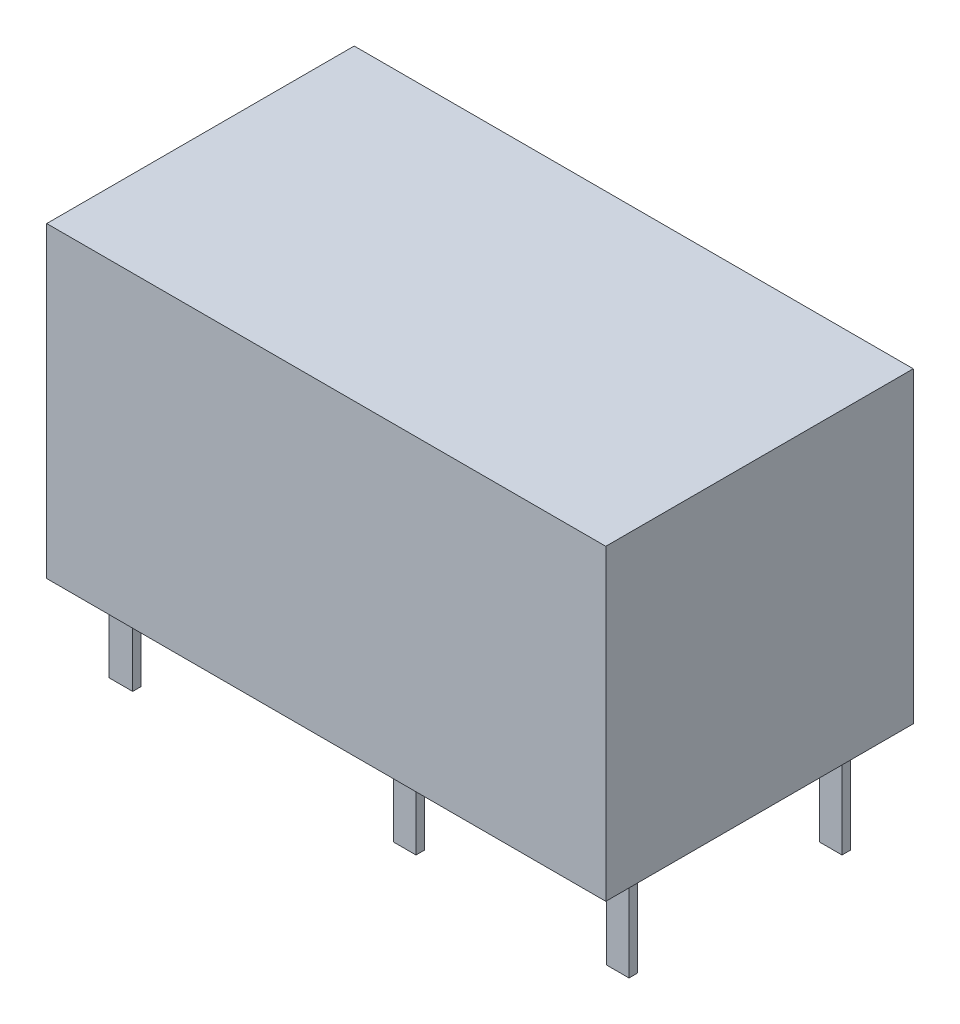
ISO-10303-21;
HEADER;
FILE_DESCRIPTION(('STEP AP214'),'2;1');
FILE_NAME('part.step','',(''),(''),'','','');
FILE_SCHEMA(('AUTOMOTIVE_DESIGN { 1 0 10303 214 1 1 1 1 }'));
ENDSEC;
DATA;
#1=APPLICATION_CONTEXT('core data for automotive mechanical design processes');
#2=APPLICATION_PROTOCOL_DEFINITION('international standard','automotive_design',2000,#1);
#3=PRODUCT_CONTEXT('',#1,'mechanical');
#4=PRODUCT('Part','Part','',(#3));
#5=PRODUCT_RELATED_PRODUCT_CATEGORY('part','',(#4));
#6=PRODUCT_DEFINITION_FORMATION('','',#4);
#7=PRODUCT_DEFINITION_CONTEXT('part definition',#1,'design');
#8=PRODUCT_DEFINITION('design','',#6,#7);
#9=PRODUCT_DEFINITION_SHAPE('','',#8);
#10=(LENGTH_UNIT() NAMED_UNIT(*) SI_UNIT(.MILLI.,.METRE.));
#11=(NAMED_UNIT(*) PLANE_ANGLE_UNIT() SI_UNIT($,.RADIAN.));
#12=(NAMED_UNIT(*) SI_UNIT($,.STERADIAN.) SOLID_ANGLE_UNIT());
#13=UNCERTAINTY_MEASURE_WITH_UNIT(LENGTH_MEASURE(1.E-05),#10,'distance_accuracy_value','');
#14=(GEOMETRIC_REPRESENTATION_CONTEXT(3) GLOBAL_UNCERTAINTY_ASSIGNED_CONTEXT((#13)) GLOBAL_UNIT_ASSIGNED_CONTEXT((#10,
#11,#12)) REPRESENTATION_CONTEXT('',''));
#15=CARTESIAN_POINT('',(0.,0.,0.));
#16=DIRECTION('',(0.,0.,1.));
#17=DIRECTION('',(1.,0.,0.));
#18=AXIS2_PLACEMENT_3D('',#15,#16,#17);
#19=CARTESIAN_POINT('',(10.,5.5,0.));
#20=DIRECTION('',(-1.,0.,0.));
#21=DIRECTION('',(0.,0.,1.));
#22=AXIS2_PLACEMENT_3D('',#19,#20,#21);
#23=PLANE('',#22);
#24=DIRECTION('',(0.,0.,-1.));
#25=VECTOR('',#24,1.);
#26=CARTESIAN_POINT('',(10.,0.,0.));
#27=LINE('',#26,#25);
#28=CARTESIAN_POINT('',(10.,0.,5.5));
#29=VERTEX_POINT('',#28);
#30=CARTESIAN_POINT('',(10.,0.,-5.5));
#31=VERTEX_POINT('',#30);
#32=EDGE_CURVE('E287',#29,#31,#27,.T.);
#33=ORIENTED_EDGE('',*,*,#32,.T.);
#34=DIRECTION('',(0.,-1.,0.));
#35=VECTOR('',#34,1.);
#36=CARTESIAN_POINT('',(10.,5.5,-5.5));
#37=LINE('',#36,#35);
#38=CARTESIAN_POINT('',(10.,11.,-5.5));
#39=VERTEX_POINT('',#38);
#40=EDGE_CURVE('E180',#39,#31,#37,.T.);
#41=ORIENTED_EDGE('',*,*,#40,.F.);
#42=DIRECTION('',(0.,0.,-1.));
#43=VECTOR('',#42,1.);
#44=CARTESIAN_POINT('',(10.,11.,0.));
#45=LINE('',#44,#43);
#46=CARTESIAN_POINT('',(10.,11.,5.5));
#47=VERTEX_POINT('',#46);
#48=EDGE_CURVE('E9',#47,#39,#45,.T.);
#49=ORIENTED_EDGE('',*,*,#48,.F.);
#50=DIRECTION('',(0.,1.,0.));
#51=VECTOR('',#50,1.);
#52=CARTESIAN_POINT('',(10.,5.5,5.5));
#53=LINE('',#52,#51);
#54=EDGE_CURVE('E183',#29,#47,#53,.T.);
#55=ORIENTED_EDGE('',*,*,#54,.F.);
#56=EDGE_LOOP('',(#33,#41,#49,#55));
#57=FACE_BOUND('',#56,.T.);
#58=ADVANCED_FACE('F15',(#57),#23,.F.);
#59=CARTESIAN_POINT('',(0.,11.,0.));
#60=DIRECTION('',(0.,-1.,0.));
#61=DIRECTION('',(0.,0.,-1.));
#62=AXIS2_PLACEMENT_3D('',#59,#60,#61);
#63=PLANE('',#62);
#64=ORIENTED_EDGE('',*,*,#48,.T.);
#65=DIRECTION('',(1.,0.,0.));
#66=VECTOR('',#65,1.);
#67=CARTESIAN_POINT('',(0.,11.,-5.5));
#68=LINE('',#67,#66);
#69=CARTESIAN_POINT('',(-10.,11.,-5.5));
#70=VERTEX_POINT('',#69);
#71=EDGE_CURVE('E19',#70,#39,#68,.T.);
#72=ORIENTED_EDGE('',*,*,#71,.F.);
#73=DIRECTION('',(0.,0.,-1.));
#74=VECTOR('',#73,1.);
#75=CARTESIAN_POINT('',(-10.,11.,0.));
#76=LINE('',#75,#74);
#77=CARTESIAN_POINT('',(-10.,11.,5.5));
#78=VERTEX_POINT('',#77);
#79=EDGE_CURVE('E25',#78,#70,#76,.T.);
#80=ORIENTED_EDGE('',*,*,#79,.F.);
#81=DIRECTION('',(-1.,0.,0.));
#82=VECTOR('',#81,1.);
#83=CARTESIAN_POINT('',(0.,11.,5.5));
#84=LINE('',#83,#82);
#85=EDGE_CURVE('E167',#47,#78,#84,.T.);
#86=ORIENTED_EDGE('',*,*,#85,.F.);
#87=EDGE_LOOP('',(#64,#72,#80,#86));
#88=FACE_BOUND('',#87,.T.);
#89=ADVANCED_FACE('F17',(#88),#63,.F.);
#90=CARTESIAN_POINT('',(-10.,5.5,0.));
#91=DIRECTION('',(1.,0.,0.));
#92=DIRECTION('',(0.,0.,-1.));
#93=AXIS2_PLACEMENT_3D('',#90,#91,#92);
#94=PLANE('',#93);
#95=ORIENTED_EDGE('',*,*,#79,.T.);
#96=DIRECTION('',(0.,1.,0.));
#97=VECTOR('',#96,1.);
#98=CARTESIAN_POINT('',(-10.,5.5,-5.5));
#99=LINE('',#98,#97);
#100=CARTESIAN_POINT('',(-10.,0.,-5.5));
#101=VERTEX_POINT('',#100);
#102=EDGE_CURVE('E237',#101,#70,#99,.T.);
#103=ORIENTED_EDGE('',*,*,#102,.F.);
#104=DIRECTION('',(0.,0.,-1.));
#105=VECTOR('',#104,1.);
#106=CARTESIAN_POINT('',(-10.,0.,0.));
#107=LINE('',#106,#105);
#108=CARTESIAN_POINT('',(-10.,0.,5.5));
#109=VERTEX_POINT('',#108);
#110=EDGE_CURVE('E176',#109,#101,#107,.T.);
#111=ORIENTED_EDGE('',*,*,#110,.F.);
#112=DIRECTION('',(0.,-1.,0.));
#113=VECTOR('',#112,1.);
#114=CARTESIAN_POINT('',(-10.,5.5,5.5));
#115=LINE('',#114,#113);
#116=EDGE_CURVE('E173',#78,#109,#115,.T.);
#117=ORIENTED_EDGE('',*,*,#116,.F.);
#118=EDGE_LOOP('',(#95,#103,#111,#117));
#119=FACE_BOUND('',#118,.T.);
#120=ADVANCED_FACE('F174',(#119),#94,.F.);
#121=CARTESIAN_POINT('',(0.,5.5,-5.5));
#122=DIRECTION('',(0.,0.,1.));
#123=DIRECTION('',(1.,0.,0.));
#124=AXIS2_PLACEMENT_3D('',#121,#122,#123);
#125=PLANE('',#124);
#126=ORIENTED_EDGE('',*,*,#40,.T.);
#127=DIRECTION('',(-1.,0.,0.));
#128=VECTOR('',#127,1.);
#129=CARTESIAN_POINT('',(0.,0.,-5.5));
#130=LINE('',#129,#128);
#131=EDGE_CURVE('E290',#31,#101,#130,.T.);
#132=ORIENTED_EDGE('',*,*,#131,.T.);
#133=ORIENTED_EDGE('',*,*,#102,.T.);
#134=ORIENTED_EDGE('',*,*,#71,.T.);
#135=EDGE_LOOP('',(#126,#132,#133,#134));
#136=FACE_BOUND('',#135,.T.);
#137=ADVANCED_FACE('F513',(#136),#125,.F.);
#138=CARTESIAN_POINT('',(0.,5.5,5.5));
#139=DIRECTION('',(0.,0.,1.));
#140=DIRECTION('',(1.,0.,0.));
#141=AXIS2_PLACEMENT_3D('',#138,#139,#140);
#142=PLANE('',#141);
#143=ORIENTED_EDGE('',*,*,#54,.T.);
#144=ORIENTED_EDGE('',*,*,#85,.T.);
#145=ORIENTED_EDGE('',*,*,#116,.T.);
#146=DIRECTION('',(1.,0.,0.));
#147=VECTOR('',#146,1.);
#148=CARTESIAN_POINT('',(0.,0.,5.5));
#149=LINE('',#148,#147);
#150=EDGE_CURVE('E286',#109,#29,#149,.T.);
#151=ORIENTED_EDGE('',*,*,#150,.T.);
#152=EDGE_LOOP('',(#143,#144,#145,#151));
#153=FACE_BOUND('',#152,.T.);
#154=ADVANCED_FACE('F182',(#153),#142,.T.);
#155=CARTESIAN_POINT('',(-8.465,-1.,3.81));
#156=DIRECTION('',(-1.,0.,0.));
#157=DIRECTION('',(0.,0.,1.));
#158=AXIS2_PLACEMENT_3D('',#155,#156,#157);
#159=PLANE('',#158);
#160=DIRECTION('',(0.,0.,-1.));
#161=VECTOR('',#160,1.);
#162=CARTESIAN_POINT('',(-8.465,0.,1.905));
#163=LINE('',#162,#161);
#164=CARTESIAN_POINT('',(-8.465,0.,3.96));
#165=VERTEX_POINT('',#164);
#166=CARTESIAN_POINT('',(-8.465,0.,3.66));
#167=VERTEX_POINT('',#166);
#168=EDGE_CURVE('E274',#165,#167,#163,.T.);
#169=ORIENTED_EDGE('',*,*,#168,.F.);
#170=DIRECTION('',(0.,1.,0.));
#171=VECTOR('',#170,1.);
#172=CARTESIAN_POINT('',(-8.465,-1.,3.96));
#173=LINE('',#172,#171);
#174=CARTESIAN_POINT('',(-8.465,-3.5,3.96));
#175=VERTEX_POINT('',#174);
#176=EDGE_CURVE('E187',#175,#165,#173,.T.);
#177=ORIENTED_EDGE('',*,*,#176,.F.);
#178=DIRECTION('',(0.,0.,-1.));
#179=VECTOR('',#178,1.);
#180=CARTESIAN_POINT('',(-8.465,-3.5,3.81));
#181=LINE('',#180,#179);
#182=CARTESIAN_POINT('',(-8.465,-3.5,3.66));
#183=VERTEX_POINT('',#182);
#184=EDGE_CURVE('E184',#175,#183,#181,.T.);
#185=ORIENTED_EDGE('',*,*,#184,.T.);
#186=DIRECTION('',(0.,-1.,0.));
#187=VECTOR('',#186,1.);
#188=CARTESIAN_POINT('',(-8.465,-1.,3.66));
#189=LINE('',#188,#187);
#190=EDGE_CURVE('E192',#167,#183,#189,.T.);
#191=ORIENTED_EDGE('',*,*,#190,.F.);
#192=EDGE_LOOP('',(#169,#177,#185,#191));
#193=FACE_BOUND('',#192,.T.);
#194=ADVANCED_FACE('F508',(#193),#159,.F.);
#195=CARTESIAN_POINT('',(-8.89,-3.5,3.81));
#196=DIRECTION('',(0.,1.,0.));
#197=DIRECTION('',(0.,0.,1.));
#198=AXIS2_PLACEMENT_3D('',#195,#196,#197);
#199=PLANE('',#198);
#200=DIRECTION('',(0.,0.,-1.));
#201=VECTOR('',#200,1.);
#202=CARTESIAN_POINT('',(-9.315,-3.5,3.81));
#203=LINE('',#202,#201);
#204=CARTESIAN_POINT('',(-9.315,-3.5,3.96));
#205=VERTEX_POINT('',#204);
#206=CARTESIAN_POINT('',(-9.315,-3.5,3.66));
#207=VERTEX_POINT('',#206);
#208=EDGE_CURVE('E198',#205,#207,#203,.T.);
#209=ORIENTED_EDGE('',*,*,#208,.T.);
#210=DIRECTION('',(-1.,0.,0.));
#211=VECTOR('',#210,1.);
#212=CARTESIAN_POINT('',(-8.89,-3.5,3.66));
#213=LINE('',#212,#211);
#214=EDGE_CURVE('E190',#183,#207,#213,.T.);
#215=ORIENTED_EDGE('',*,*,#214,.F.);
#216=ORIENTED_EDGE('',*,*,#184,.F.);
#217=DIRECTION('',(1.,0.,0.));
#218=VECTOR('',#217,1.);
#219=CARTESIAN_POINT('',(-8.89,-3.5,3.96));
#220=LINE('',#219,#218);
#221=EDGE_CURVE('E189',#205,#175,#220,.T.);
#222=ORIENTED_EDGE('',*,*,#221,.F.);
#223=EDGE_LOOP('',(#209,#215,#216,#222));
#224=FACE_BOUND('',#223,.T.);
#225=ADVANCED_FACE('F504',(#224),#199,.F.);
#226=CARTESIAN_POINT('',(-8.89,-1.,3.96));
#227=DIRECTION('',(0.,0.,1.));
#228=DIRECTION('',(1.,0.,0.));
#229=AXIS2_PLACEMENT_3D('',#226,#227,#228);
#230=PLANE('',#229);
#231=DIRECTION('',(1.,0.,0.));
#232=VECTOR('',#231,1.);
#233=CARTESIAN_POINT('',(-4.445,0.,3.96));
#234=LINE('',#233,#232);
#235=CARTESIAN_POINT('',(-9.315,0.,3.96));
#236=VERTEX_POINT('',#235);
#237=EDGE_CURVE('E277',#236,#165,#234,.T.);
#238=ORIENTED_EDGE('',*,*,#237,.F.);
#239=DIRECTION('',(0.,-1.,0.));
#240=VECTOR('',#239,1.);
#241=CARTESIAN_POINT('',(-9.315,-1.,3.96));
#242=LINE('',#241,#240);
#243=EDGE_CURVE('E195',#236,#205,#242,.T.);
#244=ORIENTED_EDGE('',*,*,#243,.T.);
#245=ORIENTED_EDGE('',*,*,#221,.T.);
#246=ORIENTED_EDGE('',*,*,#176,.T.);
#247=EDGE_LOOP('',(#238,#244,#245,#246));
#248=FACE_BOUND('',#247,.T.);
#249=ADVANCED_FACE('F500',(#248),#230,.T.);
#250=CARTESIAN_POINT('',(-8.89,-1.,3.66));
#251=DIRECTION('',(0.,0.,1.));
#252=DIRECTION('',(1.,0.,0.));
#253=AXIS2_PLACEMENT_3D('',#250,#251,#252);
#254=PLANE('',#253);
#255=DIRECTION('',(-1.,0.,0.));
#256=VECTOR('',#255,1.);
#257=CARTESIAN_POINT('',(-4.445,0.,3.66));
#258=LINE('',#257,#256);
#259=CARTESIAN_POINT('',(-9.315,0.,3.66));
#260=VERTEX_POINT('',#259);
#261=EDGE_CURVE('E283',#167,#260,#258,.T.);
#262=ORIENTED_EDGE('',*,*,#261,.F.);
#263=ORIENTED_EDGE('',*,*,#190,.T.);
#264=ORIENTED_EDGE('',*,*,#214,.T.);
#265=DIRECTION('',(0.,1.,0.));
#266=VECTOR('',#265,1.);
#267=CARTESIAN_POINT('',(-9.315,-1.,3.66));
#268=LINE('',#267,#266);
#269=EDGE_CURVE('E201',#207,#260,#268,.T.);
#270=ORIENTED_EDGE('',*,*,#269,.T.);
#271=EDGE_LOOP('',(#262,#263,#264,#270));
#272=FACE_BOUND('',#271,.T.);
#273=ADVANCED_FACE('F496',(#272),#254,.F.);
#274=CARTESIAN_POINT('',(-9.315,-1.,3.81));
#275=DIRECTION('',(1.,0.,0.));
#276=DIRECTION('',(0.,0.,-1.));
#277=AXIS2_PLACEMENT_3D('',#274,#275,#276);
#278=PLANE('',#277);
#279=DIRECTION('',(0.,0.,1.));
#280=VECTOR('',#279,1.);
#281=CARTESIAN_POINT('',(-9.315,0.,1.905));
#282=LINE('',#281,#280);
#283=EDGE_CURVE('E280',#260,#236,#282,.T.);
#284=ORIENTED_EDGE('',*,*,#283,.F.);
#285=ORIENTED_EDGE('',*,*,#269,.F.);
#286=ORIENTED_EDGE('',*,*,#208,.F.);
#287=ORIENTED_EDGE('',*,*,#243,.F.);
#288=EDGE_LOOP('',(#284,#285,#286,#287));
#289=FACE_BOUND('',#288,.T.);
#290=ADVANCED_FACE('F492',(#289),#278,.F.);
#291=CARTESIAN_POINT('',(-8.465,-1.,-3.81));
#292=DIRECTION('',(-1.,0.,0.));
#293=DIRECTION('',(0.,0.,1.));
#294=AXIS2_PLACEMENT_3D('',#291,#292,#293);
#295=PLANE('',#294);
#296=DIRECTION('',(0.,0.,-1.));
#297=VECTOR('',#296,1.);
#298=CARTESIAN_POINT('',(-8.465,0.,-1.905));
#299=LINE('',#298,#297);
#300=CARTESIAN_POINT('',(-8.465,0.,-3.66));
#301=VERTEX_POINT('',#300);
#302=CARTESIAN_POINT('',(-8.465,0.,-3.96));
#303=VERTEX_POINT('',#302);
#304=EDGE_CURVE('E262',#301,#303,#299,.T.);
#305=ORIENTED_EDGE('',*,*,#304,.F.);
#306=DIRECTION('',(0.,1.,0.));
#307=VECTOR('',#306,1.);
#308=CARTESIAN_POINT('',(-8.465,-1.,-3.66));
#309=LINE('',#308,#307);
#310=CARTESIAN_POINT('',(-8.465,-3.5,-3.66));
#311=VERTEX_POINT('',#310);
#312=EDGE_CURVE('E202',#311,#301,#309,.T.);
#313=ORIENTED_EDGE('',*,*,#312,.F.);
#314=DIRECTION('',(0.,0.,-1.));
#315=VECTOR('',#314,1.);
#316=CARTESIAN_POINT('',(-8.465,-3.5,-3.81));
#317=LINE('',#316,#315);
#318=CARTESIAN_POINT('',(-8.465,-3.5,-3.96));
#319=VERTEX_POINT('',#318);
#320=EDGE_CURVE('E199',#311,#319,#317,.T.);
#321=ORIENTED_EDGE('',*,*,#320,.T.);
#322=DIRECTION('',(0.,-1.,0.));
#323=VECTOR('',#322,1.);
#324=CARTESIAN_POINT('',(-8.465,-1.,-3.96));
#325=LINE('',#324,#323);
#326=EDGE_CURVE('E209',#303,#319,#325,.T.);
#327=ORIENTED_EDGE('',*,*,#326,.F.);
#328=EDGE_LOOP('',(#305,#313,#321,#327));
#329=FACE_BOUND('',#328,.T.);
#330=ADVANCED_FACE('F488',(#329),#295,.F.);
#331=CARTESIAN_POINT('',(-8.89,-3.5,-3.81));
#332=DIRECTION('',(0.,1.,0.));
#333=DIRECTION('',(0.,0.,1.));
#334=AXIS2_PLACEMENT_3D('',#331,#332,#333);
#335=PLANE('',#334);
#336=DIRECTION('',(0.,0.,-1.));
#337=VECTOR('',#336,1.);
#338=CARTESIAN_POINT('',(-9.315,-3.5,-3.81));
#339=LINE('',#338,#337);
#340=CARTESIAN_POINT('',(-9.315,-3.5,-3.66));
#341=VERTEX_POINT('',#340);
#342=CARTESIAN_POINT('',(-9.315,-3.5,-3.96));
#343=VERTEX_POINT('',#342);
#344=EDGE_CURVE('E215',#341,#343,#339,.T.);
#345=ORIENTED_EDGE('',*,*,#344,.T.);
#346=DIRECTION('',(-1.,0.,0.));
#347=VECTOR('',#346,1.);
#348=CARTESIAN_POINT('',(-8.89,-3.5,-3.96));
#349=LINE('',#348,#347);
#350=EDGE_CURVE('E207',#319,#343,#349,.T.);
#351=ORIENTED_EDGE('',*,*,#350,.F.);
#352=ORIENTED_EDGE('',*,*,#320,.F.);
#353=DIRECTION('',(1.,0.,0.));
#354=VECTOR('',#353,1.);
#355=CARTESIAN_POINT('',(-8.89,-3.5,-3.66));
#356=LINE('',#355,#354);
#357=EDGE_CURVE('E204',#341,#311,#356,.T.);
#358=ORIENTED_EDGE('',*,*,#357,.F.);
#359=EDGE_LOOP('',(#345,#351,#352,#358));
#360=FACE_BOUND('',#359,.T.);
#361=ADVANCED_FACE('F484',(#360),#335,.F.);
#362=CARTESIAN_POINT('',(-8.89,-1.,-3.66));
#363=DIRECTION('',(0.,0.,1.));
#364=DIRECTION('',(1.,0.,0.));
#365=AXIS2_PLACEMENT_3D('',#362,#363,#364);
#366=PLANE('',#365);
#367=DIRECTION('',(1.,0.,0.));
#368=VECTOR('',#367,1.);
#369=CARTESIAN_POINT('',(-4.445,0.,-3.66));
#370=LINE('',#369,#368);
#371=CARTESIAN_POINT('',(-9.315,0.,-3.66));
#372=VERTEX_POINT('',#371);
#373=EDGE_CURVE('E265',#372,#301,#370,.T.);
#374=ORIENTED_EDGE('',*,*,#373,.F.);
#375=DIRECTION('',(0.,-1.,0.));
#376=VECTOR('',#375,1.);
#377=CARTESIAN_POINT('',(-9.315,-1.,-3.66));
#378=LINE('',#377,#376);
#379=EDGE_CURVE('E212',#372,#341,#378,.T.);
#380=ORIENTED_EDGE('',*,*,#379,.T.);
#381=ORIENTED_EDGE('',*,*,#357,.T.);
#382=ORIENTED_EDGE('',*,*,#312,.T.);
#383=EDGE_LOOP('',(#374,#380,#381,#382));
#384=FACE_BOUND('',#383,.T.);
#385=ADVANCED_FACE('F480',(#384),#366,.T.);
#386=CARTESIAN_POINT('',(-8.89,-1.,-3.96));
#387=DIRECTION('',(0.,0.,1.));
#388=DIRECTION('',(1.,0.,0.));
#389=AXIS2_PLACEMENT_3D('',#386,#387,#388);
#390=PLANE('',#389);
#391=DIRECTION('',(-1.,0.,0.));
#392=VECTOR('',#391,1.);
#393=CARTESIAN_POINT('',(-4.445,0.,-3.96));
#394=LINE('',#393,#392);
#395=CARTESIAN_POINT('',(-9.315,0.,-3.96));
#396=VERTEX_POINT('',#395);
#397=EDGE_CURVE('E271',#303,#396,#394,.T.);
#398=ORIENTED_EDGE('',*,*,#397,.F.);
#399=ORIENTED_EDGE('',*,*,#326,.T.);
#400=ORIENTED_EDGE('',*,*,#350,.T.);
#401=DIRECTION('',(0.,1.,0.));
#402=VECTOR('',#401,1.);
#403=CARTESIAN_POINT('',(-9.315,-1.,-3.96));
#404=LINE('',#403,#402);
#405=EDGE_CURVE('E218',#343,#396,#404,.T.);
#406=ORIENTED_EDGE('',*,*,#405,.T.);
#407=EDGE_LOOP('',(#398,#399,#400,#406));
#408=FACE_BOUND('',#407,.T.);
#409=ADVANCED_FACE('F476',(#408),#390,.F.);
#410=CARTESIAN_POINT('',(-9.315,-1.,-3.81));
#411=DIRECTION('',(1.,0.,0.));
#412=DIRECTION('',(0.,0.,-1.));
#413=AXIS2_PLACEMENT_3D('',#410,#411,#412);
#414=PLANE('',#413);
#415=DIRECTION('',(0.,0.,1.));
#416=VECTOR('',#415,1.);
#417=CARTESIAN_POINT('',(-9.315,0.,-1.905));
#418=LINE('',#417,#416);
#419=EDGE_CURVE('E268',#396,#372,#418,.T.);
#420=ORIENTED_EDGE('',*,*,#419,.F.);
#421=ORIENTED_EDGE('',*,*,#405,.F.);
#422=ORIENTED_EDGE('',*,*,#344,.F.);
#423=ORIENTED_EDGE('',*,*,#379,.F.);
#424=EDGE_LOOP('',(#420,#421,#422,#423));
#425=FACE_BOUND('',#424,.T.);
#426=ADVANCED_FACE('F472',(#425),#414,.F.);
#427=CARTESIAN_POINT('',(1.67,-1.,-3.81));
#428=DIRECTION('',(-1.,0.,0.));
#429=DIRECTION('',(0.,0.,1.));
#430=AXIS2_PLACEMENT_3D('',#427,#428,#429);
#431=PLANE('',#430);
#432=DIRECTION('',(0.,0.,-1.));
#433=VECTOR('',#432,1.);
#434=CARTESIAN_POINT('',(1.67,0.,-1.905));
#435=LINE('',#434,#433);
#436=CARTESIAN_POINT('',(1.67,0.,-3.66));
#437=VERTEX_POINT('',#436);
#438=CARTESIAN_POINT('',(1.67,0.,-3.96));
#439=VERTEX_POINT('',#438);
#440=EDGE_CURVE('E292',#437,#439,#435,.T.);
#441=ORIENTED_EDGE('',*,*,#440,.F.);
#442=DIRECTION('',(0.,1.,0.));
#443=VECTOR('',#442,1.);
#444=CARTESIAN_POINT('',(1.67,-1.,-3.66));
#445=LINE('',#444,#443);
#446=CARTESIAN_POINT('',(1.67,-3.5,-3.66));
#447=VERTEX_POINT('',#446);
#448=EDGE_CURVE('E219',#447,#437,#445,.T.);
#449=ORIENTED_EDGE('',*,*,#448,.F.);
#450=DIRECTION('',(0.,0.,-1.));
#451=VECTOR('',#450,1.);
#452=CARTESIAN_POINT('',(1.67,-3.5,-3.81));
#453=LINE('',#452,#451);
#454=CARTESIAN_POINT('',(1.67,-3.5,-3.96));
#455=VERTEX_POINT('',#454);
#456=EDGE_CURVE('E216',#447,#455,#453,.T.);
#457=ORIENTED_EDGE('',*,*,#456,.T.);
#458=DIRECTION('',(0.,-1.,0.));
#459=VECTOR('',#458,1.);
#460=CARTESIAN_POINT('',(1.67,-1.,-3.96));
#461=LINE('',#460,#459);
#462=EDGE_CURVE('E226',#439,#455,#461,.T.);
#463=ORIENTED_EDGE('',*,*,#462,.F.);
#464=EDGE_LOOP('',(#441,#449,#457,#463));
#465=FACE_BOUND('',#464,.T.);
#466=ADVANCED_FACE('F468',(#465),#431,.F.);
#467=CARTESIAN_POINT('',(1.27,-3.5,-3.81));
#468=DIRECTION('',(0.,1.,0.));
#469=DIRECTION('',(0.,0.,1.));
#470=AXIS2_PLACEMENT_3D('',#467,#468,#469);
#471=PLANE('',#470);
#472=DIRECTION('',(0.,0.,-1.));
#473=VECTOR('',#472,1.);
#474=CARTESIAN_POINT('',(0.87,-3.5,-3.81));
#475=LINE('',#474,#473);
#476=CARTESIAN_POINT('',(0.87,-3.5,-3.66));
#477=VERTEX_POINT('',#476);
#478=CARTESIAN_POINT('',(0.87,-3.5,-3.96));
#479=VERTEX_POINT('',#478);
#480=EDGE_CURVE('E232',#477,#479,#475,.T.);
#481=ORIENTED_EDGE('',*,*,#480,.T.);
#482=DIRECTION('',(-1.,0.,0.));
#483=VECTOR('',#482,1.);
#484=CARTESIAN_POINT('',(1.27,-3.5,-3.96));
#485=LINE('',#484,#483);
#486=EDGE_CURVE('E224',#455,#479,#485,.T.);
#487=ORIENTED_EDGE('',*,*,#486,.F.);
#488=ORIENTED_EDGE('',*,*,#456,.F.);
#489=DIRECTION('',(1.,0.,0.));
#490=VECTOR('',#489,1.);
#491=CARTESIAN_POINT('',(1.27,-3.5,-3.66));
#492=LINE('',#491,#490);
#493=EDGE_CURVE('E221',#477,#447,#492,.T.);
#494=ORIENTED_EDGE('',*,*,#493,.F.);
#495=EDGE_LOOP('',(#481,#487,#488,#494));
#496=FACE_BOUND('',#495,.T.);
#497=ADVANCED_FACE('F464',(#496),#471,.F.);
#498=CARTESIAN_POINT('',(1.27,-1.,-3.66));
#499=DIRECTION('',(0.,0.,1.));
#500=DIRECTION('',(1.,0.,0.));
#501=AXIS2_PLACEMENT_3D('',#498,#499,#500);
#502=PLANE('',#501);
#503=DIRECTION('',(1.,0.,0.));
#504=VECTOR('',#503,1.);
#505=CARTESIAN_POINT('',(0.635,0.,-3.66));
#506=LINE('',#505,#504);
#507=CARTESIAN_POINT('',(0.87,0.,-3.66));
#508=VERTEX_POINT('',#507);
#509=EDGE_CURVE('E295',#508,#437,#506,.T.);
#510=ORIENTED_EDGE('',*,*,#509,.F.);
#511=DIRECTION('',(0.,-1.,0.));
#512=VECTOR('',#511,1.);
#513=CARTESIAN_POINT('',(0.87,-1.,-3.66));
#514=LINE('',#513,#512);
#515=EDGE_CURVE('E229',#508,#477,#514,.T.);
#516=ORIENTED_EDGE('',*,*,#515,.T.);
#517=ORIENTED_EDGE('',*,*,#493,.T.);
#518=ORIENTED_EDGE('',*,*,#448,.T.);
#519=EDGE_LOOP('',(#510,#516,#517,#518));
#520=FACE_BOUND('',#519,.T.);
#521=ADVANCED_FACE('F460',(#520),#502,.T.);
#522=CARTESIAN_POINT('',(1.27,-1.,-3.96));
#523=DIRECTION('',(0.,0.,1.));
#524=DIRECTION('',(1.,0.,0.));
#525=AXIS2_PLACEMENT_3D('',#522,#523,#524);
#526=PLANE('',#525);
#527=DIRECTION('',(-1.,0.,0.));
#528=VECTOR('',#527,1.);
#529=CARTESIAN_POINT('',(0.635,0.,-3.96));
#530=LINE('',#529,#528);
#531=CARTESIAN_POINT('',(0.87,0.,-3.96));
#532=VERTEX_POINT('',#531);
#533=EDGE_CURVE('E301',#439,#532,#530,.T.);
#534=ORIENTED_EDGE('',*,*,#533,.F.);
#535=ORIENTED_EDGE('',*,*,#462,.T.);
#536=ORIENTED_EDGE('',*,*,#486,.T.);
#537=DIRECTION('',(0.,1.,0.));
#538=VECTOR('',#537,1.);
#539=CARTESIAN_POINT('',(0.87,-1.,-3.96));
#540=LINE('',#539,#538);
#541=EDGE_CURVE('E235',#479,#532,#540,.T.);
#542=ORIENTED_EDGE('',*,*,#541,.T.);
#543=EDGE_LOOP('',(#534,#535,#536,#542));
#544=FACE_BOUND('',#543,.T.);
#545=ADVANCED_FACE('F456',(#544),#526,.F.);
#546=CARTESIAN_POINT('',(0.87,-1.,-3.81));
#547=DIRECTION('',(1.,0.,0.));
#548=DIRECTION('',(0.,0.,-1.));
#549=AXIS2_PLACEMENT_3D('',#546,#547,#548);
#550=PLANE('',#549);
#551=DIRECTION('',(0.,0.,1.));
#552=VECTOR('',#551,1.);
#553=CARTESIAN_POINT('',(0.87,0.,-1.905));
#554=LINE('',#553,#552);
#555=EDGE_CURVE('E298',#532,#508,#554,.T.);
#556=ORIENTED_EDGE('',*,*,#555,.F.);
#557=ORIENTED_EDGE('',*,*,#541,.F.);
#558=ORIENTED_EDGE('',*,*,#480,.F.);
#559=ORIENTED_EDGE('',*,*,#515,.F.);
#560=EDGE_LOOP('',(#556,#557,#558,#559));
#561=FACE_BOUND('',#560,.T.);
#562=ADVANCED_FACE('F422',(#561),#550,.F.);
#563=CARTESIAN_POINT('',(1.67,-1.,3.81));
#564=DIRECTION('',(-1.,0.,0.));
#565=DIRECTION('',(0.,0.,1.));
#566=AXIS2_PLACEMENT_3D('',#563,#564,#565);
#567=PLANE('',#566);
#568=DIRECTION('',(0.,0.,-1.));
#569=VECTOR('',#568,1.);
#570=CARTESIAN_POINT('',(1.67,0.,1.905));
#571=LINE('',#570,#569);
#572=CARTESIAN_POINT('',(1.67,0.,3.96));
#573=VERTEX_POINT('',#572);
#574=CARTESIAN_POINT('',(1.67,0.,3.66));
#575=VERTEX_POINT('',#574);
#576=EDGE_CURVE('E304',#573,#575,#571,.T.);
#577=ORIENTED_EDGE('',*,*,#576,.F.);
#578=DIRECTION('',(0.,1.,0.));
#579=VECTOR('',#578,1.);
#580=CARTESIAN_POINT('',(1.67,-1.,3.96));
#581=LINE('',#580,#579);
#582=CARTESIAN_POINT('',(1.67,-3.5,3.96));
#583=VERTEX_POINT('',#582);
#584=EDGE_CURVE('E241',#583,#573,#581,.T.);
#585=ORIENTED_EDGE('',*,*,#584,.F.);
#586=DIRECTION('',(0.,0.,-1.));
#587=VECTOR('',#586,1.);
#588=CARTESIAN_POINT('',(1.67,-3.5,3.81));
#589=LINE('',#588,#587);
#590=CARTESIAN_POINT('',(1.67,-3.5,3.66));
#591=VERTEX_POINT('',#590);
#592=EDGE_CURVE('E239',#583,#591,#589,.T.);
#593=ORIENTED_EDGE('',*,*,#592,.T.);
#594=DIRECTION('',(0.,-1.,0.));
#595=VECTOR('',#594,1.);
#596=CARTESIAN_POINT('',(1.67,-1.,3.66));
#597=LINE('',#596,#595);
#598=EDGE_CURVE('E248',#575,#591,#597,.T.);
#599=ORIENTED_EDGE('',*,*,#598,.F.);
#600=EDGE_LOOP('',(#577,#585,#593,#599));
#601=FACE_BOUND('',#600,.T.);
#602=ADVANCED_FACE('F411',(#601),#567,.F.);
#603=CARTESIAN_POINT('',(1.27,-3.5,3.81));
#604=DIRECTION('',(0.,1.,0.));
#605=DIRECTION('',(0.,0.,1.));
#606=AXIS2_PLACEMENT_3D('',#603,#604,#605);
#607=PLANE('',#606);
#608=DIRECTION('',(0.,0.,-1.));
#609=VECTOR('',#608,1.);
#610=CARTESIAN_POINT('',(0.87,-3.5,3.81));
#611=LINE('',#610,#609);
#612=CARTESIAN_POINT('',(0.87,-3.5,3.96));
#613=VERTEX_POINT('',#612);
#614=CARTESIAN_POINT('',(0.87,-3.5,3.66));
#615=VERTEX_POINT('',#614);
#616=EDGE_CURVE('E255',#613,#615,#611,.T.);
#617=ORIENTED_EDGE('',*,*,#616,.T.);
#618=DIRECTION('',(-1.,0.,0.));
#619=VECTOR('',#618,1.);
#620=CARTESIAN_POINT('',(1.27,-3.5,3.66));
#621=LINE('',#620,#619);
#622=EDGE_CURVE('E246',#591,#615,#621,.T.);
#623=ORIENTED_EDGE('',*,*,#622,.F.);
#624=ORIENTED_EDGE('',*,*,#592,.F.);
#625=DIRECTION('',(1.,0.,0.));
#626=VECTOR('',#625,1.);
#627=CARTESIAN_POINT('',(1.27,-3.5,3.96));
#628=LINE('',#627,#626);
#629=EDGE_CURVE('E243',#613,#583,#628,.T.);
#630=ORIENTED_EDGE('',*,*,#629,.F.);
#631=EDGE_LOOP('',(#617,#623,#624,#630));
#632=FACE_BOUND('',#631,.T.);
#633=ADVANCED_FACE('F413',(#632),#607,.F.);
#634=CARTESIAN_POINT('',(1.27,-1.,3.96));
#635=DIRECTION('',(0.,0.,1.));
#636=DIRECTION('',(1.,0.,0.));
#637=AXIS2_PLACEMENT_3D('',#634,#635,#636);
#638=PLANE('',#637);
#639=DIRECTION('',(1.,0.,0.));
#640=VECTOR('',#639,1.);
#641=CARTESIAN_POINT('',(0.635,0.,3.96));
#642=LINE('',#641,#640);
#643=CARTESIAN_POINT('',(0.87,0.,3.96));
#644=VERTEX_POINT('',#643);
#645=EDGE_CURVE('E305',#644,#573,#642,.T.);
#646=ORIENTED_EDGE('',*,*,#645,.F.);
#647=DIRECTION('',(0.,-1.,0.));
#648=VECTOR('',#647,1.);
#649=CARTESIAN_POINT('',(0.87,-1.,3.96));
#650=LINE('',#649,#648);
#651=EDGE_CURVE('E252',#644,#613,#650,.T.);
#652=ORIENTED_EDGE('',*,*,#651,.T.);
#653=ORIENTED_EDGE('',*,*,#629,.T.);
#654=ORIENTED_EDGE('',*,*,#584,.T.);
#655=EDGE_LOOP('',(#646,#652,#653,#654));
#656=FACE_BOUND('',#655,.T.);
#657=ADVANCED_FACE('F410',(#656),#638,.T.);
#658=CARTESIAN_POINT('',(1.27,-1.,3.66));
#659=DIRECTION('',(0.,0.,1.));
#660=DIRECTION('',(1.,0.,0.));
#661=AXIS2_PLACEMENT_3D('',#658,#659,#660);
#662=PLANE('',#661);
#663=DIRECTION('',(-1.,0.,0.));
#664=VECTOR('',#663,1.);
#665=CARTESIAN_POINT('',(0.635,0.,3.66));
#666=LINE('',#665,#664);
#667=CARTESIAN_POINT('',(0.87,0.,3.66));
#668=VERTEX_POINT('',#667);
#669=EDGE_CURVE('E310',#575,#668,#666,.T.);
#670=ORIENTED_EDGE('',*,*,#669,.F.);
#671=ORIENTED_EDGE('',*,*,#598,.T.);
#672=ORIENTED_EDGE('',*,*,#622,.T.);
#673=DIRECTION('',(0.,1.,0.));
#674=VECTOR('',#673,1.);
#675=CARTESIAN_POINT('',(0.87,-1.,3.66));
#676=LINE('',#675,#674);
#677=EDGE_CURVE('E260',#615,#668,#676,.T.);
#678=ORIENTED_EDGE('',*,*,#677,.T.);
#679=EDGE_LOOP('',(#670,#671,#672,#678));
#680=FACE_BOUND('',#679,.T.);
#681=ADVANCED_FACE('F402',(#680),#662,.F.);
#682=CARTESIAN_POINT('',(0.87,-1.,3.81));
#683=DIRECTION('',(1.,0.,0.));
#684=DIRECTION('',(0.,0.,-1.));
#685=AXIS2_PLACEMENT_3D('',#682,#683,#684);
#686=PLANE('',#685);
#687=DIRECTION('',(0.,0.,1.));
#688=VECTOR('',#687,1.);
#689=CARTESIAN_POINT('',(0.87,0.,1.905));
#690=LINE('',#689,#688);
#691=EDGE_CURVE('E308',#668,#644,#690,.T.);
#692=ORIENTED_EDGE('',*,*,#691,.F.);
#693=ORIENTED_EDGE('',*,*,#677,.F.);
#694=ORIENTED_EDGE('',*,*,#616,.F.);
#695=ORIENTED_EDGE('',*,*,#651,.F.);
#696=EDGE_LOOP('',(#692,#693,#694,#695));
#697=FACE_BOUND('',#696,.T.);
#698=ADVANCED_FACE('F408',(#697),#686,.F.);
#699=CARTESIAN_POINT('',(0.,0.,0.));
#700=DIRECTION('',(0.,1.,0.));
#701=DIRECTION('',(0.,0.,1.));
#702=AXIS2_PLACEMENT_3D('',#699,#700,#701);
#703=PLANE('',#702);
#704=DIRECTION('',(-1.,0.,0.));
#705=VECTOR('',#704,1.);
#706=CARTESIAN_POINT('',(4.445,0.,3.66));
#707=LINE('',#706,#705);
#708=CARTESIAN_POINT('',(9.29,0.,3.66));
#709=VERTEX_POINT('',#708);
#710=CARTESIAN_POINT('',(8.49,0.,3.66));
#711=VERTEX_POINT('',#710);
#712=EDGE_CURVE('E371',#709,#711,#707,.T.);
#713=ORIENTED_EDGE('',*,*,#712,.T.);
#714=DIRECTION('',(0.,0.,1.));
#715=VECTOR('',#714,1.);
#716=CARTESIAN_POINT('',(8.49,0.,1.905));
#717=LINE('',#716,#715);
#718=CARTESIAN_POINT('',(8.49,0.,3.96));
#719=VERTEX_POINT('',#718);
#720=EDGE_CURVE('E389',#711,#719,#717,.T.);
#721=ORIENTED_EDGE('',*,*,#720,.T.);
#722=DIRECTION('',(1.,0.,0.));
#723=VECTOR('',#722,1.);
#724=CARTESIAN_POINT('',(4.445,0.,3.96));
#725=LINE('',#724,#723);
#726=CARTESIAN_POINT('',(9.29,0.,3.96));
#727=VERTEX_POINT('',#726);
#728=EDGE_CURVE('E357',#719,#727,#725,.T.);
#729=ORIENTED_EDGE('',*,*,#728,.T.);
#730=DIRECTION('',(0.,0.,-1.));
#731=VECTOR('',#730,1.);
#732=CARTESIAN_POINT('',(9.29,0.,1.905));
#733=LINE('',#732,#731);
#734=EDGE_CURVE('E344',#727,#709,#733,.T.);
#735=ORIENTED_EDGE('',*,*,#734,.T.);
#736=EDGE_LOOP('',(#713,#721,#729,#735));
#737=FACE_BOUND('',#736,.T.);
#738=DIRECTION('',(-1.,0.,0.));
#739=VECTOR('',#738,1.);
#740=CARTESIAN_POINT('',(4.445,0.,-3.96));
#741=LINE('',#740,#739);
#742=CARTESIAN_POINT('',(9.29,0.,-3.96));
#743=VERTEX_POINT('',#742);
#744=CARTESIAN_POINT('',(8.49,0.,-3.96));
#745=VERTEX_POINT('',#744);
#746=EDGE_CURVE('E333',#743,#745,#741,.T.);
#747=ORIENTED_EDGE('',*,*,#746,.T.);
#748=DIRECTION('',(0.,0.,1.));
#749=VECTOR('',#748,1.);
#750=CARTESIAN_POINT('',(8.49,0.,-1.905));
#751=LINE('',#750,#749);
#752=CARTESIAN_POINT('',(8.49,0.,-3.66));
#753=VERTEX_POINT('',#752);
#754=EDGE_CURVE('E341',#745,#753,#751,.T.);
#755=ORIENTED_EDGE('',*,*,#754,.T.);
#756=DIRECTION('',(1.,0.,0.));
#757=VECTOR('',#756,1.);
#758=CARTESIAN_POINT('',(4.445,0.,-3.66));
#759=LINE('',#758,#757);
#760=CARTESIAN_POINT('',(9.29,0.,-3.66));
#761=VERTEX_POINT('',#760);
#762=EDGE_CURVE('E325',#753,#761,#759,.T.);
#763=ORIENTED_EDGE('',*,*,#762,.T.);
#764=DIRECTION('',(0.,0.,-1.));
#765=VECTOR('',#764,1.);
#766=CARTESIAN_POINT('',(9.29,0.,-1.905));
#767=LINE('',#766,#765);
#768=EDGE_CURVE('E314',#761,#743,#767,.T.);
#769=ORIENTED_EDGE('',*,*,#768,.T.);
#770=EDGE_LOOP('',(#747,#755,#763,#769));
#771=FACE_BOUND('',#770,.T.);
#772=ORIENTED_EDGE('',*,*,#397,.T.);
#773=ORIENTED_EDGE('',*,*,#419,.T.);
#774=ORIENTED_EDGE('',*,*,#373,.T.);
#775=ORIENTED_EDGE('',*,*,#304,.T.);
#776=EDGE_LOOP('',(#772,#773,#774,#775));
#777=FACE_BOUND('',#776,.T.);
#778=ORIENTED_EDGE('',*,*,#261,.T.);
#779=ORIENTED_EDGE('',*,*,#283,.T.);
#780=ORIENTED_EDGE('',*,*,#237,.T.);
#781=ORIENTED_EDGE('',*,*,#168,.T.);
#782=EDGE_LOOP('',(#778,#779,#780,#781));
#783=FACE_BOUND('',#782,.T.);
#784=ORIENTED_EDGE('',*,*,#110,.T.);
#785=ORIENTED_EDGE('',*,*,#131,.F.);
#786=ORIENTED_EDGE('',*,*,#32,.F.);
#787=ORIENTED_EDGE('',*,*,#150,.F.);
#788=EDGE_LOOP('',(#784,#785,#786,#787));
#789=FACE_BOUND('',#788,.T.);
#790=ORIENTED_EDGE('',*,*,#533,.T.);
#791=ORIENTED_EDGE('',*,*,#555,.T.);
#792=ORIENTED_EDGE('',*,*,#509,.T.);
#793=ORIENTED_EDGE('',*,*,#440,.T.);
#794=EDGE_LOOP('',(#790,#791,#792,#793));
#795=FACE_BOUND('',#794,.T.);
#796=ORIENTED_EDGE('',*,*,#669,.T.);
#797=ORIENTED_EDGE('',*,*,#691,.T.);
#798=ORIENTED_EDGE('',*,*,#645,.T.);
#799=ORIENTED_EDGE('',*,*,#576,.T.);
#800=EDGE_LOOP('',(#796,#797,#798,#799));
#801=FACE_BOUND('',#800,.T.);
#802=ADVANCED_FACE('F397',(#737,#771,#777,#783,#789,#795,#801),#703,.F.);
#803=CARTESIAN_POINT('',(9.29,-1.,-3.81));
#804=DIRECTION('',(-1.,0.,0.));
#805=DIRECTION('',(0.,0.,1.));
#806=AXIS2_PLACEMENT_3D('',#803,#804,#805);
#807=PLANE('',#806);
#808=ORIENTED_EDGE('',*,*,#768,.F.);
#809=DIRECTION('',(0.,1.,0.));
#810=VECTOR('',#809,1.);
#811=CARTESIAN_POINT('',(9.29,-1.,-3.66));
#812=LINE('',#811,#810);
#813=CARTESIAN_POINT('',(9.29,-3.5,-3.66));
#814=VERTEX_POINT('',#813);
#815=EDGE_CURVE('E318',#814,#761,#812,.T.);
#816=ORIENTED_EDGE('',*,*,#815,.F.);
#817=DIRECTION('',(0.,0.,-1.));
#818=VECTOR('',#817,1.);
#819=CARTESIAN_POINT('',(9.29,-3.5,-3.81));
#820=LINE('',#819,#818);
#821=CARTESIAN_POINT('',(9.29,-3.5,-3.96));
#822=VERTEX_POINT('',#821);
#823=EDGE_CURVE('E316',#814,#822,#820,.T.);
#824=ORIENTED_EDGE('',*,*,#823,.T.);
#825=DIRECTION('',(0.,-1.,0.));
#826=VECTOR('',#825,1.);
#827=CARTESIAN_POINT('',(9.29,-1.,-3.96));
#828=LINE('',#827,#826);
#829=EDGE_CURVE('E330',#743,#822,#828,.T.);
#830=ORIENTED_EDGE('',*,*,#829,.F.);
#831=EDGE_LOOP('',(#808,#816,#824,#830));
#832=FACE_BOUND('',#831,.T.);
#833=ADVANCED_FACE('F450',(#832),#807,.F.);
#834=CARTESIAN_POINT('',(8.89,-3.5,-3.81));
#835=DIRECTION('',(0.,1.,0.));
#836=DIRECTION('',(0.,0.,1.));
#837=AXIS2_PLACEMENT_3D('',#834,#835,#836);
#838=PLANE('',#837);
#839=DIRECTION('',(0.,0.,-1.));
#840=VECTOR('',#839,1.);
#841=CARTESIAN_POINT('',(8.49,-3.5,-3.81));
#842=LINE('',#841,#840);
#843=CARTESIAN_POINT('',(8.49,-3.5,-3.66));
#844=VERTEX_POINT('',#843);
#845=CARTESIAN_POINT('',(8.49,-3.5,-3.96));
#846=VERTEX_POINT('',#845);
#847=EDGE_CURVE('E340',#844,#846,#842,.T.);
#848=ORIENTED_EDGE('',*,*,#847,.T.);
#849=DIRECTION('',(-1.,0.,0.));
#850=VECTOR('',#849,1.);
#851=CARTESIAN_POINT('',(8.89,-3.5,-3.96));
#852=LINE('',#851,#850);
#853=EDGE_CURVE('E328',#822,#846,#852,.T.);
#854=ORIENTED_EDGE('',*,*,#853,.F.);
#855=ORIENTED_EDGE('',*,*,#823,.F.);
#856=DIRECTION('',(1.,0.,0.));
#857=VECTOR('',#856,1.);
#858=CARTESIAN_POINT('',(8.89,-3.5,-3.66));
#859=LINE('',#858,#857);
#860=EDGE_CURVE('E322',#844,#814,#859,.T.);
#861=ORIENTED_EDGE('',*,*,#860,.F.);
#862=EDGE_LOOP('',(#848,#854,#855,#861));
#863=FACE_BOUND('',#862,.T.);
#864=ADVANCED_FACE('F446',(#863),#838,.F.);
#865=CARTESIAN_POINT('',(8.89,-1.,-3.66));
#866=DIRECTION('',(0.,0.,1.));
#867=DIRECTION('',(1.,0.,0.));
#868=AXIS2_PLACEMENT_3D('',#865,#866,#867);
#869=PLANE('',#868);
#870=ORIENTED_EDGE('',*,*,#762,.F.);
#871=DIRECTION('',(0.,-1.,0.));
#872=VECTOR('',#871,1.);
#873=CARTESIAN_POINT('',(8.49,-1.,-3.66));
#874=LINE('',#873,#872);
#875=EDGE_CURVE('E336',#753,#844,#874,.T.);
#876=ORIENTED_EDGE('',*,*,#875,.T.);
#877=ORIENTED_EDGE('',*,*,#860,.T.);
#878=ORIENTED_EDGE('',*,*,#815,.T.);
#879=EDGE_LOOP('',(#870,#876,#877,#878));
#880=FACE_BOUND('',#879,.T.);
#881=ADVANCED_FACE('F442',(#880),#869,.T.);
#882=CARTESIAN_POINT('',(8.89,-1.,-3.96));
#883=DIRECTION('',(0.,0.,1.));
#884=DIRECTION('',(1.,0.,0.));
#885=AXIS2_PLACEMENT_3D('',#882,#883,#884);
#886=PLANE('',#885);
#887=ORIENTED_EDGE('',*,*,#746,.F.);
#888=ORIENTED_EDGE('',*,*,#829,.T.);
#889=ORIENTED_EDGE('',*,*,#853,.T.);
#890=DIRECTION('',(0.,1.,0.));
#891=VECTOR('',#890,1.);
#892=CARTESIAN_POINT('',(8.49,-1.,-3.96));
#893=LINE('',#892,#891);
#894=EDGE_CURVE('E337',#846,#745,#893,.T.);
#895=ORIENTED_EDGE('',*,*,#894,.T.);
#896=EDGE_LOOP('',(#887,#888,#889,#895));
#897=FACE_BOUND('',#896,.T.);
#898=ADVANCED_FACE('F438',(#897),#886,.F.);
#899=CARTESIAN_POINT('',(8.49,-1.,-3.81));
#900=DIRECTION('',(1.,0.,0.));
#901=DIRECTION('',(0.,0.,-1.));
#902=AXIS2_PLACEMENT_3D('',#899,#900,#901);
#903=PLANE('',#902);
#904=ORIENTED_EDGE('',*,*,#754,.F.);
#905=ORIENTED_EDGE('',*,*,#894,.F.);
#906=ORIENTED_EDGE('',*,*,#847,.F.);
#907=ORIENTED_EDGE('',*,*,#875,.F.);
#908=EDGE_LOOP('',(#904,#905,#906,#907));
#909=FACE_BOUND('',#908,.T.);
#910=ADVANCED_FACE('F435',(#909),#903,.F.);
#911=CARTESIAN_POINT('',(9.29,-1.,3.81));
#912=DIRECTION('',(-1.,0.,0.));
#913=DIRECTION('',(0.,0.,1.));
#914=AXIS2_PLACEMENT_3D('',#911,#912,#913);
#915=PLANE('',#914);
#916=ORIENTED_EDGE('',*,*,#734,.F.);
#917=DIRECTION('',(0.,1.,0.));
#918=VECTOR('',#917,1.);
#919=CARTESIAN_POINT('',(9.29,-1.,3.96));
#920=LINE('',#919,#918);
#921=CARTESIAN_POINT('',(9.29,-3.5,3.96));
#922=VERTEX_POINT('',#921);
#923=EDGE_CURVE('E350',#922,#727,#920,.T.);
#924=ORIENTED_EDGE('',*,*,#923,.F.);
#925=DIRECTION('',(0.,0.,-1.));
#926=VECTOR('',#925,1.);
#927=CARTESIAN_POINT('',(9.29,-3.5,3.81));
#928=LINE('',#927,#926);
#929=CARTESIAN_POINT('',(9.29,-3.5,3.66));
#930=VERTEX_POINT('',#929);
#931=EDGE_CURVE('E347',#922,#930,#928,.T.);
#932=ORIENTED_EDGE('',*,*,#931,.T.);
#933=DIRECTION('',(0.,-1.,0.));
#934=VECTOR('',#933,1.);
#935=CARTESIAN_POINT('',(9.29,-1.,3.66));
#936=LINE('',#935,#934);
#937=EDGE_CURVE('E367',#709,#930,#936,.T.);
#938=ORIENTED_EDGE('',*,*,#937,.F.);
#939=EDGE_LOOP('',(#916,#924,#932,#938));
#940=FACE_BOUND('',#939,.T.);
#941=ADVANCED_FACE('F433',(#940),#915,.F.);
#942=CARTESIAN_POINT('',(8.89,-3.5,3.81));
#943=DIRECTION('',(0.,1.,0.));
#944=DIRECTION('',(0.,0.,1.));
#945=AXIS2_PLACEMENT_3D('',#942,#943,#944);
#946=PLANE('',#945);
#947=DIRECTION('',(0.,0.,-1.));
#948=VECTOR('',#947,1.);
#949=CARTESIAN_POINT('',(8.49,-3.5,3.81));
#950=LINE('',#949,#948);
#951=CARTESIAN_POINT('',(8.49,-3.5,3.96));
#952=VERTEX_POINT('',#951);
#953=CARTESIAN_POINT('',(8.49,-3.5,3.66));
#954=VERTEX_POINT('',#953);
#955=EDGE_CURVE('E381',#952,#954,#950,.T.);
#956=ORIENTED_EDGE('',*,*,#955,.T.);
#957=DIRECTION('',(-1.,0.,0.));
#958=VECTOR('',#957,1.);
#959=CARTESIAN_POINT('',(8.89,-3.5,3.66));
#960=LINE('',#959,#958);
#961=EDGE_CURVE('E362',#930,#954,#960,.T.);
#962=ORIENTED_EDGE('',*,*,#961,.F.);
#963=ORIENTED_EDGE('',*,*,#931,.F.);
#964=DIRECTION('',(1.,0.,0.));
#965=VECTOR('',#964,1.);
#966=CARTESIAN_POINT('',(8.89,-3.5,3.96));
#967=LINE('',#966,#965);
#968=EDGE_CURVE('E353',#952,#922,#967,.T.);
#969=ORIENTED_EDGE('',*,*,#968,.F.);
#970=EDGE_LOOP('',(#956,#962,#963,#969));
#971=FACE_BOUND('',#970,.T.);
#972=ADVANCED_FACE('F675',(#971),#946,.F.);
#973=CARTESIAN_POINT('',(8.89,-1.,3.96));
#974=DIRECTION('',(0.,0.,1.));
#975=DIRECTION('',(1.,0.,0.));
#976=AXIS2_PLACEMENT_3D('',#973,#974,#975);
#977=PLANE('',#976);
#978=ORIENTED_EDGE('',*,*,#728,.F.);
#979=DIRECTION('',(0.,-1.,0.));
#980=VECTOR('',#979,1.);
#981=CARTESIAN_POINT('',(8.49,-1.,3.96));
#982=LINE('',#981,#980);
#983=EDGE_CURVE('E376',#719,#952,#982,.T.);
#984=ORIENTED_EDGE('',*,*,#983,.T.);
#985=ORIENTED_EDGE('',*,*,#968,.T.);
#986=ORIENTED_EDGE('',*,*,#923,.T.);
#987=EDGE_LOOP('',(#978,#984,#985,#986));
#988=FACE_BOUND('',#987,.T.);
#989=ADVANCED_FACE('F684',(#988),#977,.T.);
#990=CARTESIAN_POINT('',(8.89,-1.,3.66));
#991=DIRECTION('',(0.,0.,1.));
#992=DIRECTION('',(1.,0.,0.));
#993=AXIS2_PLACEMENT_3D('',#990,#991,#992);
#994=PLANE('',#993);
#995=ORIENTED_EDGE('',*,*,#712,.F.);
#996=ORIENTED_EDGE('',*,*,#937,.T.);
#997=ORIENTED_EDGE('',*,*,#961,.T.);
#998=DIRECTION('',(0.,1.,0.));
#999=VECTOR('',#998,1.);
#1000=CARTESIAN_POINT('',(8.49,-1.,3.66));
#1001=LINE('',#1000,#999);
#1002=EDGE_CURVE('E386',#954,#711,#1001,.T.);
#1003=ORIENTED_EDGE('',*,*,#1002,.T.);
#1004=EDGE_LOOP('',(#995,#996,#997,#1003));
#1005=FACE_BOUND('',#1004,.T.);
#1006=ADVANCED_FACE('F693',(#1005),#994,.F.);
#1007=CARTESIAN_POINT('',(8.49,-1.,3.81));
#1008=DIRECTION('',(1.,0.,0.));
#1009=DIRECTION('',(0.,0.,-1.));
#1010=AXIS2_PLACEMENT_3D('',#1007,#1008,#1009);
#1011=PLANE('',#1010);
#1012=ORIENTED_EDGE('',*,*,#720,.F.);
#1013=ORIENTED_EDGE('',*,*,#1002,.F.);
#1014=ORIENTED_EDGE('',*,*,#955,.F.);
#1015=ORIENTED_EDGE('',*,*,#983,.F.);
#1016=EDGE_LOOP('',(#1012,#1013,#1014,#1015));
#1017=FACE_BOUND('',#1016,.T.);
#1018=ADVANCED_FACE('F702',(#1017),#1011,.F.);
#1019=CLOSED_SHELL('',(#58,#89,#120,#137,#154,#194,#225,#249,#273,#290,#330,#361,#385,#409,#426,
#466,#497,#521,#545,#562,#602,#633,#657,#681,#698,#802,#833,#864,#881,#898,#910,#941,#972,#989,
#1006,#1018));
#1020=MANIFOLD_SOLID_BREP('B1',#1019);
#1021=ADVANCED_BREP_SHAPE_REPRESENTATION('',(#18,#1020),#14);
#1022=SHAPE_DEFINITION_REPRESENTATION(#9,#1021);
ENDSEC;
END-ISO-10303-21;
